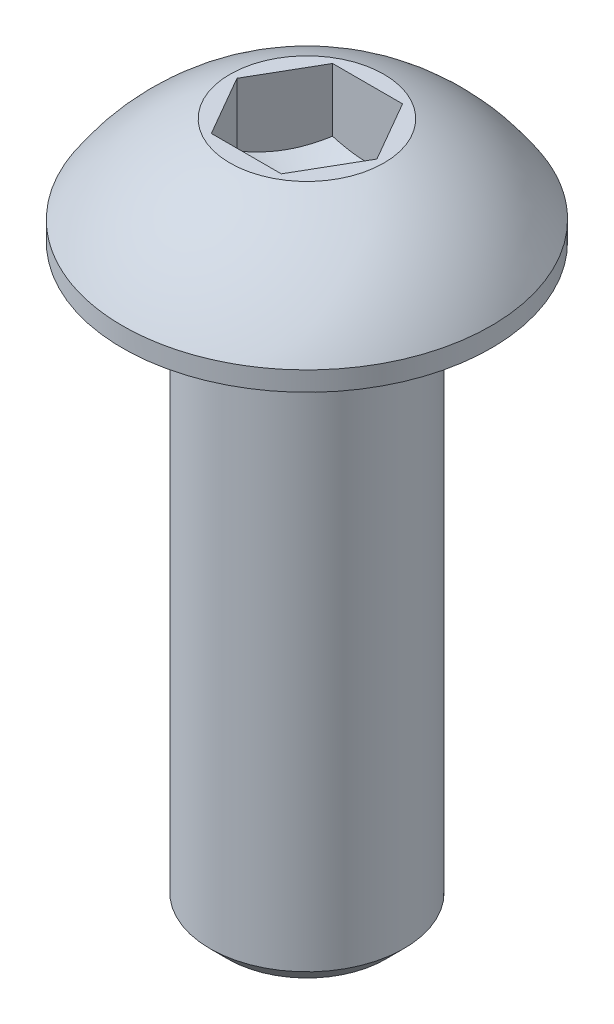
ISO-10303-21;
HEADER;
FILE_DESCRIPTION(('STEP AP214'),'2;1');
FILE_NAME('part.step','',(''),(''),'','','');
FILE_SCHEMA(('AUTOMOTIVE_DESIGN { 1 0 10303 214 1 1 1 1 }'));
ENDSEC;
DATA;
#1=APPLICATION_CONTEXT('core data for automotive mechanical design processes');
#2=APPLICATION_PROTOCOL_DEFINITION('international standard','automotive_design',2000,#1);
#3=PRODUCT_CONTEXT('',#1,'mechanical');
#4=PRODUCT('Part','Part','',(#3));
#5=PRODUCT_RELATED_PRODUCT_CATEGORY('part','',(#4));
#6=PRODUCT_DEFINITION_FORMATION('','',#4);
#7=PRODUCT_DEFINITION_CONTEXT('part definition',#1,'design');
#8=PRODUCT_DEFINITION('design','',#6,#7);
#9=PRODUCT_DEFINITION_SHAPE('','',#8);
#10=(LENGTH_UNIT() NAMED_UNIT(*) SI_UNIT(.MILLI.,.METRE.));
#11=(NAMED_UNIT(*) PLANE_ANGLE_UNIT() SI_UNIT($,.RADIAN.));
#12=(NAMED_UNIT(*) SI_UNIT($,.STERADIAN.) SOLID_ANGLE_UNIT());
#13=UNCERTAINTY_MEASURE_WITH_UNIT(LENGTH_MEASURE(1.E-05),#10,'distance_accuracy_value','');
#14=(GEOMETRIC_REPRESENTATION_CONTEXT(3) GLOBAL_UNCERTAINTY_ASSIGNED_CONTEXT((#13)) GLOBAL_UNIT_ASSIGNED_CONTEXT((#10,
#11,#12)) REPRESENTATION_CONTEXT('',''));
#15=CARTESIAN_POINT('',(0.,0.,0.));
#16=DIRECTION('',(0.,0.,1.));
#17=DIRECTION('',(1.,0.,0.));
#18=AXIS2_PLACEMENT_3D('',#15,#16,#17);
#19=CARTESIAN_POINT('',(-30.0000000000002,102.555381555533,5.00000000000031));
#20=DIRECTION('',(0.,1.,0.));
#21=DIRECTION('',(0.,0.,1.));
#22=AXIS2_PLACEMENT_3D('',#19,#20,#21);
#23=CONICAL_SURFACE('',#22,1.45182112759781,1.04719755102484);
#24=CARTESIAN_POINT('',(-31.4425009344978,102.550000607324,5.00000173704625));
#25=CARTESIAN_POINT('',(-31.410819479413,102.531703843318,4.94509446058189));
#26=CARTESIAN_POINT('',(-31.3788645203618,102.515065492756,4.88971321817337));
#27=CARTESIAN_POINT('',(-31.3144015746558,102.486027407757,4.77799231909157));
#28=CARTESIAN_POINT('',(-31.2818924447597,102.473637942221,4.72165068115827));
#29=CARTESIAN_POINT('',(-31.2172774082382,102.454358012273,4.6096662217099));
#30=CARTESIAN_POINT('',(-31.185181431385,102.44733905443,4.55404060976605));
#31=CARTESIAN_POINT('',(-31.1208390033007,102.43897001528,4.44252860112849));
#32=CARTESIAN_POINT('',(-31.0885927850041,102.4376129893,4.38664260813041));
#33=CARTESIAN_POINT('',(-31.0283172388499,102.440485620125,4.28217892365365));
#34=CARTESIAN_POINT('',(-31.000278874552,102.444019311793,4.23358557119319));
#35=CARTESIAN_POINT('',(-30.9443853171187,102.455206810491,4.13671632078358));
#36=CARTESIAN_POINT('',(-30.9165303181566,102.46286443872,4.08844075935681));
#37=CARTESIAN_POINT('',(-30.8605220282846,102.482002010411,3.99137266601796));
#38=CARTESIAN_POINT('',(-30.8323758422625,102.493563031245,3.94259244760199));
#39=CARTESIAN_POINT('',(-30.7765037158745,102.51979767783,3.84576033946362));
#40=CARTESIAN_POINT('',(-30.7487770574664,102.534465133101,3.79770720530085));
#41=CARTESIAN_POINT('',(-30.721249415442,102.550379544239,3.74999898690109));
#42=B_SPLINE_CURVE_WITH_KNOTS('',3,(#24,#25,#26,#27,#28,#29,#30,#31,#32,#33,#34,#35,#36,#37,#38,
#39,#40,#41),.UNSPECIFIED.,.F.,.F.,(4,2,2,2,2,2,2,2,4),(0.,0.198016347624792,0.396507952137321,
0.590087601482667,0.783429744788845,0.951909558632739,1.12054575346618,1.29292547618727,
1.46496595032371),.UNSPECIFIED.);
#43=CARTESIAN_POINT('',(-31.4425009368987,102.550000540922,5.00000009283334));
#44=VERTEX_POINT('',#43);
#45=CARTESIAN_POINT('',(-30.7212507379526,102.550379667054,3.74999950439706));
#46=VERTEX_POINT('',#45);
#47=EDGE_CURVE('E184',#44,#46,#42,.T.);
#48=ORIENTED_EDGE('',*,*,#47,.F.);
#49=CARTESIAN_POINT('',(-30.7212493477697,102.5503795772,6.25000121040915));
#50=CARTESIAN_POINT('',(-30.7529414630262,102.53205197295,6.19507548277011));
#51=CARTESIAN_POINT('',(-30.7849071388119,102.515380783234,6.13967567700744));
#52=CARTESIAN_POINT('',(-30.8493925376701,102.486274400232,6.02791587153329));
#53=CARTESIAN_POINT('',(-30.8819134102336,102.473849511414,5.9715538797005));
#54=CARTESIAN_POINT('',(-30.9465523748851,102.454499087759,5.85952794846716));
#55=CARTESIAN_POINT('',(-30.9786604999822,102.447444995303,5.80388128305856));
#56=CARTESIAN_POINT('',(-31.0430286594106,102.439008210663,5.69232467986737));
#57=CARTESIAN_POINT('',(-31.0752884582773,102.43761855235,5.6364151501668));
#58=CARTESIAN_POINT('',(-31.1355645357797,102.440434374817,5.53195054469247));
#59=CARTESIAN_POINT('',(-31.1635897468472,102.443939101548,5.48337998816502));
#60=CARTESIAN_POINT('',(-31.2194580550743,102.455067201903,5.38655449724099));
#61=CARTESIAN_POINT('',(-31.2473009593221,102.462694390664,5.33829989718028));
#62=CARTESIAN_POINT('',(-31.3032853049853,102.48177080445,5.24127330159502));
#63=CARTESIAN_POINT('',(-31.3314196637436,102.493301075418,5.19251358103878));
#64=CARTESIAN_POINT('',(-31.387268810722,102.519475780463,5.09572129857133));
#65=CARTESIAN_POINT('',(-31.4149843142277,102.534114056184,5.04768749699719));
#66=CARTESIAN_POINT('',(-31.4425008839922,102.550000510376,4.99999846795169));
#67=B_SPLINE_CURVE_WITH_KNOTS('',3,(#49,#50,#51,#52,#53,#54,#55,#56,#57,#58,#59,#60,#61,#62,#63,
#64,#65,#66),.UNSPECIFIED.,.F.,.F.,(4,2,2,2,2,2,2,2,4),(0.,0.198103571832307,0.39668452226255,
0.590348169787471,0.783773577558266,0.952169294667911,1.12072112127578,1.29301265591581,
1.4649659373382),.UNSPECIFIED.);
#68=CARTESIAN_POINT('',(-30.7212506140921,102.550379679614,6.25000059218622));
#69=VERTEX_POINT('',#68);
#70=EDGE_CURVE('E190',#69,#44,#67,.T.);
#71=ORIENTED_EDGE('',*,*,#70,.F.);
#72=CARTESIAN_POINT('',(-30.0000000000002,102.43886007314,6.25000000000031));
#73=CARTESIAN_POINT('',(-30.0306143036005,102.438856176585,6.25000000000031));
#74=CARTESIAN_POINT('',(-30.0612244571772,102.439509811159,6.25000000000031));
#75=CARTESIAN_POINT('',(-30.1223847403642,102.44209786512,6.25000000000031));
#76=CARTESIAN_POINT('',(-30.1529348806337,102.444032031571,6.25000000000031));
#77=CARTESIAN_POINT('',(-30.2441210440493,102.451677932129,6.25000000000031));
#78=CARTESIAN_POINT('',(-30.3046096866325,102.459233798249,6.25000000000031));
#79=CARTESIAN_POINT('',(-30.4247902706306,102.478664722068,6.25000000000031));
#80=CARTESIAN_POINT('',(-30.4844830224988,102.490534971946,6.25000000000031));
#81=CARTESIAN_POINT('',(-30.6033554278899,102.517911616148,6.25000000000031));
#82=CARTESIAN_POINT('',(-30.6625309411676,102.533436154556,6.25000000000031));
#83=CARTESIAN_POINT('',(-30.7212518888143,102.550379751289,6.25000000000031));
#84=B_SPLINE_CURVE_WITH_KNOTS('',3,(#72,#73,#74,#75,#76,#77,#78,#79,#80,#81,#82,#83),
.UNSPECIFIED.,.F.,.F.,(4,2,2,2,2,4),(0.,0.0918281955853517,0.183638258208279,0.366310716538347,
0.548780231075905,0.732175590344024),.UNSPECIFIED.);
#85=CARTESIAN_POINT('',(-30.0000000000002,102.438859948153,6.2499997834998));
#86=VERTEX_POINT('',#85);
#87=EDGE_CURVE('E196',#86,#69,#84,.T.);
#88=ORIENTED_EDGE('',*,*,#87,.F.);
#89=CARTESIAN_POINT('',(-30.0000000000002,102.438860073164,6.25000000003245));
#90=CARTESIAN_POINT('',(-29.9999999999397,102.408789746638,6.19791666668859));
#91=CARTESIAN_POINT('',(-29.9999999998867,102.378719420111,6.1458333333446));
#92=CARTESIAN_POINT('',(-29.999999999796,102.318578767059,6.04166666665663));
#93=CARTESIAN_POINT('',(-29.9999999997582,102.288508440533,5.98958333331265));
#94=CARTESIAN_POINT('',(-29.9999999996976,102.22836778748,5.88541666662492));
#95=CARTESIAN_POINT('',(-29.999999999675,102.198297460953,5.83333333328119));
#96=CARTESIAN_POINT('',(-29.9999999996447,102.138156807902,5.72916666659272));
#97=CARTESIAN_POINT('',(-29.9999999996371,102.108086481377,5.677083333248));
#98=CARTESIAN_POINT('',(-29.9999999996371,102.047945828342,5.57291666659887));
#99=CARTESIAN_POINT('',(-29.9999999996447,102.017875501832,5.52083333329446));
#100=CARTESIAN_POINT('',(-29.999999999675,101.95773484878,5.41666666660624));
#101=CARTESIAN_POINT('',(-29.9999999996976,101.927664522238,5.36458333322244));
#102=CARTESIAN_POINT('',(-29.9999999997582,101.867523869187,5.26041666653373));
#103=CARTESIAN_POINT('',(-29.999999999796,101.837453542677,5.20833333322884));
#104=CARTESIAN_POINT('',(-29.9999999998867,101.77731288964,5.10416666658116));
#105=CARTESIAN_POINT('',(-29.9999999999397,101.747242563111,5.05208333323837));
#106=CARTESIAN_POINT('',(-30.0000000000002,101.71717223659,4.99999999989148));
#107=B_SPLINE_CURVE_WITH_KNOTS('',3,(#89,#90,#91,#92,#93,#94,#95,#96,#97,#98,#99,#100,#101,#102,
#103,#104,#105,#106),.UNSPECIFIED.,.F.,.F.,(4,2,2,2,2,2,2,2,4),(0.,0.180421959158307,
0.360843918316614,0.541265877474921,0.721687836633228,0.902109795664658,1.08253175494984,
1.26295371398127,1.44337567313958),.UNSPECIFIED.);
#108=CARTESIAN_POINT('',(-30.0000000000002,101.717172236619,4.99999999994347));
#109=VERTEX_POINT('',#108);
#110=EDGE_CURVE('E135',#86,#109,#107,.T.);
#111=ORIENTED_EDGE('',*,*,#110,.T.);
#112=DIRECTION('',(0.,-0.499999999999998,0.86602540378444));
#113=VECTOR('',#112,1.);
#114=CARTESIAN_POINT('',(-30.0000000000002,288202.388249205,-499000.));
#115=LINE('',#114,#113);
#116=CARTESIAN_POINT('',(-30.0000000000002,102.438860073103,3.75000000004108));
#117=VERTEX_POINT('',#116);
#118=EDGE_CURVE('E122',#109,#117,#115,.F.);
#119=ORIENTED_EDGE('',*,*,#118,.T.);
#120=CARTESIAN_POINT('',(-30.7212520262086,102.550379872105,3.75000012399811));
#121=CARTESIAN_POINT('',(-30.6625310778555,102.533436220286,3.75000004436325));
#122=CARTESIAN_POINT('',(-30.6033555562019,102.517911655819,3.75000001184473));
#123=CARTESIAN_POINT('',(-30.48448312796,102.490534986166,3.74999998821569));
#124=CARTESIAN_POINT('',(-30.4247903616632,102.478664736714,3.74999999689695));
#125=CARTESIAN_POINT('',(-30.3046097513678,102.459233808794,3.75000000310712));
#126=CARTESIAN_POINT('',(-30.2441210969323,102.451677938053,3.75000000062361));
#127=CARTESIAN_POINT('',(-30.1529349146619,102.444032033674,3.74999999968704));
#128=CARTESIAN_POINT('',(-30.1223847677006,102.44209786647,3.74999999984366));
#129=CARTESIAN_POINT('',(-30.0612244709165,102.439509811546,3.75000000015699));
#130=CARTESIAN_POINT('',(-30.0306143104343,102.438856176772,3.7500000003137));
#131=CARTESIAN_POINT('',(-30.0000000000001,102.43886007314,3.75000000000031));
#132=B_SPLINE_CURVE_WITH_KNOTS('',3,(#120,#121,#122,#123,#124,#125,#126,#127,#128,#129,#130,
#131),.UNSPECIFIED.,.F.,.F.,(4,2,2,2,2,4),(0.,0.18339540321598,0.365864958952668,
0.548537454782071,0.640347537511257,0.732175753737438),.UNSPECIFIED.);
#133=EDGE_CURVE('E179',#46,#117,#132,.T.);
#134=ORIENTED_EDGE('',*,*,#133,.F.);
#135=EDGE_LOOP('',(#48,#71,#88,#111,#119,#134));
#136=FACE_BOUND('',#135,.T.);
#137=ADVANCED_FACE('F17',(#136),#23,.F.);
#138=CARTESIAN_POINT('',(-30.0000000000002,102.555381555419,5.00000000000031));
#139=DIRECTION('',(0.,1.,0.));
#140=DIRECTION('',(0.,0.,1.));
#141=AXIS2_PLACEMENT_3D('',#138,#139,#140);
#142=CONICAL_SURFACE('',#141,1.45182112749384,1.04719755107241);
#143=CARTESIAN_POINT('',(-28.5574990655019,102.55000060728,4.99999826293781));
#144=CARTESIAN_POINT('',(-28.5891805205821,102.531703843273,5.05490553940403));
#145=CARTESIAN_POINT('',(-28.6211354796314,102.515065492711,5.11028678181326));
#146=CARTESIAN_POINT('',(-28.6855984253358,102.486027407713,5.2220076808953));
#147=CARTESIAN_POINT('',(-28.7181075552323,102.473637942179,5.27834931882814));
#148=CARTESIAN_POINT('',(-28.7827225917539,102.454358012232,5.39033377827591));
#149=CARTESIAN_POINT('',(-28.8148185686069,102.44733905439,5.44595939021964));
#150=CARTESIAN_POINT('',(-28.8791609966908,102.43897001524,5.55747139885689));
#151=CARTESIAN_POINT('',(-28.9114072149874,102.437612989259,5.61335739185479));
#152=CARTESIAN_POINT('',(-28.9716827611427,102.440485620083,5.71782107633344));
#153=CARTESIAN_POINT('',(-28.9997211254418,102.44401931175,5.76641442879598));
#154=CARTESIAN_POINT('',(-29.0556146828775,102.455206810447,5.86328367920978));
#155=CARTESIAN_POINT('',(-29.0834696818409,102.462864438675,5.91155924063868));
#156=CARTESIAN_POINT('',(-29.1394779717153,102.482002010365,6.00862733398175));
#157=CARTESIAN_POINT('',(-29.1676241577386,102.493563031199,6.05740755239983));
#158=CARTESIAN_POINT('',(-29.2234962841291,102.519797677782,6.15423966054253));
#159=CARTESIAN_POINT('',(-29.2512229425384,102.534465133052,6.20229279470752));
#160=CARTESIAN_POINT('',(-29.2787505845642,102.550379544189,6.25000101310953));
#161=B_SPLINE_CURVE_WITH_KNOTS('',3,(#143,#144,#145,#146,#147,#148,#149,#150,#151,#152,#153,
#154,#155,#156,#157,#158,#159,#160),.UNSPECIFIED.,.F.,.F.,(4,2,2,2,2,2,2,2,4),(0.,
0.198016347623609,0.3965079521347,0.590087601479405,0.783429744785066,0.951909558636019,
1.12054575347647,1.29292547620428,1.46496595034753),.UNSPECIFIED.);
#162=CARTESIAN_POINT('',(-28.5574990630946,102.550000540873,4.99999990716563));
#163=VERTEX_POINT('',#162);
#164=CARTESIAN_POINT('',(-29.278749262043,102.550379667005,6.25000049560901));
#165=VERTEX_POINT('',#164);
#166=EDGE_CURVE('E219',#163,#165,#161,.T.);
#167=ORIENTED_EDGE('',*,*,#166,.F.);
#168=CARTESIAN_POINT('',(-29.2787504943448,102.550379471608,3.74999887806983));
#169=CARTESIAN_POINT('',(-29.2470584297994,102.532051909024,3.80492463647616));
#170=CARTESIAN_POINT('',(-29.2150927772432,102.515380739639,3.86032445065578));
#171=CARTESIAN_POINT('',(-29.1506074004943,102.486274377935,3.97208425350117));
#172=CARTESIAN_POINT('',(-29.1180865267484,102.473849490071,4.02844623424679));
#173=CARTESIAN_POINT('',(-29.0534475659152,102.454499072361,4.14047214952056));
#174=CARTESIAN_POINT('',(-29.0213394456449,102.447444984883,4.19611880994691));
#175=CARTESIAN_POINT('',(-28.9569712944508,102.439008207817,4.30767540132477));
#176=CARTESIAN_POINT('',(-28.9247114989942,102.437618552086,4.36358492419518));
#177=CARTESIAN_POINT('',(-28.8644354281433,102.440434378398,4.46804951756581));
#178=CARTESIAN_POINT('',(-28.8364102202487,102.443939106563,4.51662006879011));
#179=CARTESIAN_POINT('',(-28.7805419182114,102.455067208681,4.61344554913111));
#180=CARTESIAN_POINT('',(-28.7526990169809,102.46269439778,4.66170014391106));
#181=CARTESIAN_POINT('',(-28.6967146777987,102.481770811208,4.75872672822188));
#182=CARTESIAN_POINT('',(-28.6685803224987,102.493301081405,4.8074864427951));
#183=CARTESIAN_POINT('',(-28.612731182433,102.519475784036,4.9042787133035));
#184=CARTESIAN_POINT('',(-28.5850156823806,102.534114058104,4.95231250890331));
#185=CARTESIAN_POINT('',(-28.5574991160025,102.550000510327,5.0000015320586));
#186=B_SPLINE_CURVE_WITH_KNOTS('',3,(#168,#169,#170,#171,#172,#173,#174,#175,#176,#177,#178,
#179,#180,#181,#182,#183,#184,#185),.UNSPECIFIED.,.F.,.F.,(4,2,2,2,2,2,2,2,4),(0.,
0.198103544048142,0.396684468195019,0.5903480936196,0.783773478657684,0.952169177537967,
1.12072098628025,1.29301250018237,1.46496576036911),.UNSPECIFIED.);
#187=CARTESIAN_POINT('',(-29.2787488271108,102.550379803612,3.74999948217506));
#188=VERTEX_POINT('',#187);
#189=EDGE_CURVE('E21',#188,#163,#186,.T.);
#190=ORIENTED_EDGE('',*,*,#189,.F.);
#191=CARTESIAN_POINT('',(-30.0000000000001,102.438860073099,3.75000000000031));
#192=CARTESIAN_POINT('',(-29.9693856877621,102.438856176539,3.75000000000031));
#193=CARTESIAN_POINT('',(-29.9387755255513,102.439509811484,3.75000000000031));
#194=CARTESIAN_POINT('',(-29.8776152251495,102.442097866901,3.75000000000031));
#195=CARTESIAN_POINT('',(-29.8470650762994,102.444032034435,3.75000000000031));
#196=CARTESIAN_POINT('',(-29.7558788874749,102.451677939229,3.75000000000031));
#197=CARTESIAN_POINT('',(-29.6953902281852,102.459233809489,3.75000000000031));
#198=CARTESIAN_POINT('',(-29.5752096113873,102.478664743593,3.75000000000031));
#199=CARTESIAN_POINT('',(-29.5155168434246,102.490534999607,3.75000000000031));
#200=CARTESIAN_POINT('',(-29.3966444061429,102.517911657509,3.75000000000031));
#201=CARTESIAN_POINT('',(-29.3374688770733,102.533436203494,3.75000000000031));
#202=CARTESIAN_POINT('',(-29.2787479138688,102.550379808171,3.75000000000031));
#203=B_SPLINE_CURVE_WITH_KNOTS('',3,(#191,#192,#193,#194,#195,#196,#197,#198,#199,#200,#201,
#202),.UNSPECIFIED.,.F.,.F.,(4,2,2,2,2,4),(0.,0.091828221486108,0.18363830998466,
0.36631081943489,0.548780384858538,0.732175795635302),.UNSPECIFIED.);
#204=EDGE_CURVE('E103',#117,#188,#203,.T.);
#205=ORIENTED_EDGE('',*,*,#204,.F.);
#206=ORIENTED_EDGE('',*,*,#118,.F.);
#207=ORIENTED_EDGE('',*,*,#110,.F.);
#208=CARTESIAN_POINT('',(-29.2787479737771,102.550379872061,6.24999987599491));
#209=CARTESIAN_POINT('',(-29.337468922131,102.533436220241,6.24999995563465));
#210=CARTESIAN_POINT('',(-29.3966444437858,102.517911655773,6.24999998815517));
#211=CARTESIAN_POINT('',(-29.5155168720304,102.490534986121,6.25000001178566));
#212=CARTESIAN_POINT('',(-29.5752096383287,102.47866473667,6.25000000310386));
#213=CARTESIAN_POINT('',(-29.6953902486267,102.459233808752,6.24999999689331));
#214=CARTESIAN_POINT('',(-29.7558789030634,102.451677938011,6.24999999937697));
#215=CARTESIAN_POINT('',(-29.8470650853355,102.444032033633,6.2500000003136));
#216=CARTESIAN_POINT('',(-29.8776152322974,102.442097866429,6.25000000015697));
#217=CARTESIAN_POINT('',(-29.9387755290826,102.439509811505,6.24999999984362));
#218=CARTESIAN_POINT('',(-29.9693856895654,102.438856176731,6.2499999996869));
#219=CARTESIAN_POINT('',(-30.0000000000002,102.438860073099,6.25000000000031));
#220=B_SPLINE_CURVE_WITH_KNOTS('',3,(#208,#209,#210,#211,#212,#213,#214,#215,#216,#217,#218,
#219),.UNSPECIFIED.,.F.,.F.,(4,2,2,2,2,4),(0.,0.183395403219622,0.365864958959963,
0.548537454792752,0.640347537523615,0.732175753751514),.UNSPECIFIED.);
#221=EDGE_CURVE('E213',#165,#86,#220,.T.);
#222=ORIENTED_EDGE('',*,*,#221,.F.);
#223=EDGE_LOOP('',(#167,#190,#205,#206,#207,#222));
#224=FACE_BOUND('',#223,.T.);
#225=ADVANCED_FACE('F128',(#224),#142,.F.);
#226=CARTESIAN_POINT('',(-28.5457747860706,101.610428354967,5.02032099467887));
#227=DIRECTION('',(-0.866156744758905,0.,0.499772441725889));
#228=DIRECTION('',(0.499772441725889,0.,0.866156744758905));
#229=AXIS2_PLACEMENT_3D('',#226,#227,#228);
#230=PLANE('',#229);
#231=ORIENTED_EDGE('',*,*,#189,.T.);
#232=DIRECTION('',(0.,1.,0.));
#233=VECTOR('',#232,1.);
#234=CARTESIAN_POINT('',(-28.5575000000002,101.610428354967,5.00000000000028));
#235=LINE('',#234,#233);
#236=CARTESIAN_POINT('',(-28.5574998872849,103.85,5.00000058675331));
#237=VERTEX_POINT('',#236);
#238=EDGE_CURVE('E91',#237,#163,#235,.F.);
#239=ORIENTED_EDGE('',*,*,#238,.F.);
#240=DIRECTION('',(0.499772441725941,0.,0.866156744758875));
#241=VECTOR('',#240,1.);
#242=CARTESIAN_POINT('',(-29.2787500000002,103.85,3.75000000000031));
#243=LINE('',#242,#241);
#244=CARTESIAN_POINT('',(-29.2787470566511,103.85,3.75000000000031));
#245=VERTEX_POINT('',#244);
#246=EDGE_CURVE('E85',#245,#237,#243,.T.);
#247=ORIENTED_EDGE('',*,*,#246,.F.);
#248=DIRECTION('',(0.,1.,0.));
#249=VECTOR('',#248,1.);
#250=CARTESIAN_POINT('',(-29.2787470566511,101.610428354967,3.75000000000031));
#251=LINE('',#250,#249);
#252=EDGE_CURVE('E88',#188,#245,#251,.T.);
#253=ORIENTED_EDGE('',*,*,#252,.F.);
#254=EDGE_LOOP('',(#231,#239,#247,#253));
#255=FACE_BOUND('',#254,.T.);
#256=ADVANCED_FACE('F87',(#255),#230,.T.);
#257=CARTESIAN_POINT('',(-29.2904752139297,101.610428354967,6.27032099467887));
#258=DIRECTION('',(-0.866156744758906,0.,-0.499772441725888));
#259=DIRECTION('',(-0.499772441725888,0.,0.866156744758906));
#260=AXIS2_PLACEMENT_3D('',#257,#258,#259);
#261=PLANE('',#260);
#262=ORIENTED_EDGE('',*,*,#166,.T.);
#263=DIRECTION('',(0.,1.,0.));
#264=VECTOR('',#263,1.);
#265=CARTESIAN_POINT('',(-29.2787500000003,101.610428354967,6.25000000000031));
#266=LINE('',#265,#264);
#267=CARTESIAN_POINT('',(-29.2787502258029,103.85,6.25000000000031));
#268=VERTEX_POINT('',#267);
#269=EDGE_CURVE('E218',#268,#165,#266,.F.);
#270=ORIENTED_EDGE('',*,*,#269,.F.);
#271=DIRECTION('',(-0.499772441725993,0.,0.866156744758845));
#272=VECTOR('',#271,1.);
#273=CARTESIAN_POINT('',(-28.5575000000001,103.85,5.00000000000031));
#274=LINE('',#273,#272);
#275=EDGE_CURVE('E96',#237,#268,#274,.T.);
#276=ORIENTED_EDGE('',*,*,#275,.F.);
#277=ORIENTED_EDGE('',*,*,#238,.T.);
#278=EDGE_LOOP('',(#262,#270,#276,#277));
#279=FACE_BOUND('',#278,.T.);
#280=ADVANCED_FACE('F209',(#279),#261,.T.);
#281=CARTESIAN_POINT('',(-30.7447111053966,101.610428354967,6.25000000000031));
#282=DIRECTION('',(0.,0.,-1.));
#283=DIRECTION('',(-1.,0.,0.));
#284=AXIS2_PLACEMENT_3D('',#281,#282,#283);
#285=PLANE('',#284);
#286=ORIENTED_EDGE('',*,*,#87,.T.);
#287=DIRECTION('',(0.,1.,0.));
#288=VECTOR('',#287,1.);
#289=CARTESIAN_POINT('',(-30.7212500000002,101.610428354967,6.25000000000026));
#290=LINE('',#289,#288);
#291=CARTESIAN_POINT('',(-30.7212501837922,103.85,6.24999968147011));
#292=VERTEX_POINT('',#291);
#293=EDGE_CURVE('E195',#292,#69,#290,.F.);
#294=ORIENTED_EDGE('',*,*,#293,.F.);
#295=DIRECTION('',(1.,0.,0.));
#296=VECTOR('',#295,1.);
#297=CARTESIAN_POINT('',(-31.6184850000003,103.85,6.25000000000031));
#298=LINE('',#297,#296);
#299=EDGE_CURVE('E143',#268,#292,#298,.F.);
#300=ORIENTED_EDGE('',*,*,#299,.F.);
#301=ORIENTED_EDGE('',*,*,#269,.T.);
#302=ORIENTED_EDGE('',*,*,#221,.T.);
#303=EDGE_LOOP('',(#286,#294,#300,#301,#302));
#304=FACE_BOUND('',#303,.T.);
#305=ADVANCED_FACE('F205',(#304),#285,.T.);
#306=CARTESIAN_POINT('',(-31.4542252139297,101.610428354967,4.97967900532175));
#307=DIRECTION('',(0.866156744758905,0.,-0.499772441725889));
#308=DIRECTION('',(-0.499772441725889,0.,-0.866156744758905));
#309=AXIS2_PLACEMENT_3D('',#306,#307,#308);
#310=PLANE('',#309);
#311=ORIENTED_EDGE('',*,*,#70,.T.);
#312=DIRECTION('',(0.,1.,0.));
#313=VECTOR('',#312,1.);
#314=CARTESIAN_POINT('',(-31.4425000000002,101.610428354967,5.0000000000003));
#315=LINE('',#314,#313);
#316=CARTESIAN_POINT('',(-31.4424998306193,103.85,4.99999970644586));
#317=VERTEX_POINT('',#316);
#318=EDGE_CURVE('E189',#317,#44,#315,.F.);
#319=ORIENTED_EDGE('',*,*,#318,.F.);
#320=DIRECTION('',(-0.499772441725836,0.,-0.866156744758936));
#321=VECTOR('',#320,1.);
#322=CARTESIAN_POINT('',(-30.7212500000003,103.85,6.25000000000031));
#323=LINE('',#322,#321);
#324=EDGE_CURVE('E113',#292,#317,#323,.T.);
#325=ORIENTED_EDGE('',*,*,#324,.F.);
#326=ORIENTED_EDGE('',*,*,#293,.T.);
#327=EDGE_LOOP('',(#311,#319,#325,#326));
#328=FACE_BOUND('',#327,.T.);
#329=ADVANCED_FACE('F202',(#328),#310,.T.);
#330=CARTESIAN_POINT('',(-30.7095247860707,101.610428354967,3.72967900532175));
#331=DIRECTION('',(0.866156744758906,0.,0.499772441725888));
#332=DIRECTION('',(0.499772441725888,0.,-0.866156744758906));
#333=AXIS2_PLACEMENT_3D('',#330,#331,#332);
#334=PLANE('',#333);
#335=ORIENTED_EDGE('',*,*,#47,.T.);
#336=DIRECTION('',(0.,1.,0.));
#337=VECTOR('',#336,1.);
#338=CARTESIAN_POINT('',(-30.7212500000002,101.610428354967,3.75000000000031));
#339=LINE('',#338,#337);
#340=CARTESIAN_POINT('',(-30.7212497741976,103.85,3.75000000000031));
#341=VERTEX_POINT('',#340);
#342=EDGE_CURVE('E40',#341,#46,#339,.F.);
#343=ORIENTED_EDGE('',*,*,#342,.F.);
#344=DIRECTION('',(0.499772441725888,0.,-0.866156744758905));
#345=VECTOR('',#344,1.);
#346=CARTESIAN_POINT('',(-31.4425000000002,103.85,5.00000000000031));
#347=LINE('',#346,#345);
#348=EDGE_CURVE('E107',#317,#341,#347,.T.);
#349=ORIENTED_EDGE('',*,*,#348,.F.);
#350=ORIENTED_EDGE('',*,*,#318,.T.);
#351=EDGE_LOOP('',(#335,#343,#349,#350));
#352=FACE_BOUND('',#351,.T.);
#353=ADVANCED_FACE('F175',(#352),#334,.T.);
#354=CARTESIAN_POINT('',(-29.2552888946038,101.610428354967,3.75000000000031));
#355=DIRECTION('',(0.,0.,1.));
#356=DIRECTION('',(1.,0.,0.));
#357=AXIS2_PLACEMENT_3D('',#354,#355,#356);
#358=PLANE('',#357);
#359=ORIENTED_EDGE('',*,*,#204,.T.);
#360=ORIENTED_EDGE('',*,*,#252,.T.);
#361=DIRECTION('',(1.,0.,0.));
#362=VECTOR('',#361,1.);
#363=CARTESIAN_POINT('',(-31.6184850000003,103.85,3.75000000000031));
#364=LINE('',#363,#362);
#365=EDGE_CURVE('E100',#341,#245,#364,.T.);
#366=ORIENTED_EDGE('',*,*,#365,.F.);
#367=ORIENTED_EDGE('',*,*,#342,.T.);
#368=ORIENTED_EDGE('',*,*,#133,.T.);
#369=EDGE_LOOP('',(#359,#360,#366,#367,#368));
#370=FACE_BOUND('',#369,.T.);
#371=ADVANCED_FACE('F99',(#370),#358,.T.);
#372=CARTESIAN_POINT('',(-31.6184850000003,103.85,6.61848500000031));
#373=DIRECTION('',(0.,1.,0.));
#374=DIRECTION('',(0.,0.,1.));
#375=AXIS2_PLACEMENT_3D('',#372,#373,#374);
#376=PLANE('',#375);
#377=CARTESIAN_POINT('',(-30.0000000000002,103.85,3.41324999999905));
#378=CARTESIAN_POINT('',(-29.9109378537396,103.85,3.41325504270341));
#379=CARTESIAN_POINT('',(-29.82171720208,103.85,3.42078967678643));
#380=CARTESIAN_POINT('',(-29.6898616124458,103.85,3.44320989971469));
#381=CARTESIAN_POINT('',(-29.6461831003794,103.85,3.45255590348604));
#382=CARTESIAN_POINT('',(-29.559725505005,103.85,3.47490099594449));
#383=CARTESIAN_POINT('',(-29.516947181995,103.85,3.48790304913285));
#384=CARTESIAN_POINT('',(-29.3906372924842,103.849999999999,3.53221441934427));
#385=CARTESIAN_POINT('',(-29.308918205035,103.85,3.56886534150499));
#386=CARTESIAN_POINT('',(-29.1527995679228,103.85,3.65538430229451));
#387=CARTESIAN_POINT('',(-29.078400296654,103.849999999999,3.70525284336202));
#388=CARTESIAN_POINT('',(-28.9739072496696,103.85,3.78884044182003));
#389=CARTESIAN_POINT('',(-28.9402408588876,103.85,3.81818917665612));
#390=CARTESIAN_POINT('',(-28.875529210165,103.85,3.8795854087374));
#391=CARTESIAN_POINT('',(-28.8444814563534,103.85,3.91163027668697));
#392=CARTESIAN_POINT('',(-28.7555379346317,103.85,4.0115529035981));
#393=CARTESIAN_POINT('',(-28.7018193042047,103.85,4.08323680219793));
#394=CARTESIAN_POINT('',(-28.6072110661824,103.85,4.23456680566875));
#395=CARTESIAN_POINT('',(-28.5663209748423,103.85,4.31421261015894));
#396=CARTESIAN_POINT('',(-28.498485051424,103.85,4.47924746647695));
#397=CARTESIAN_POINT('',(-28.4715390704163,103.85,4.56463645695387));
#398=CARTESIAN_POINT('',(-28.4323672519397,103.85,4.7387243327779));
#399=CARTESIAN_POINT('',(-28.4201414930831,103.85,4.82742323579875));
#400=CARTESIAN_POINT('',(-28.4107536009073,103.85,5.00561465855965));
#401=CARTESIAN_POINT('',(-28.413591467588,103.85,5.09510717829971));
#402=CARTESIAN_POINT('',(-28.4342538089119,103.85,5.27234737555389));
#403=CARTESIAN_POINT('',(-28.4520782035208,103.85,5.36009506238357));
#404=CARTESIAN_POINT('',(-28.5021972317674,103.85,5.53134429395423));
#405=CARTESIAN_POINT('',(-28.5344920199567,103.85,5.61484579333299));
#406=CARTESIAN_POINT('',(-28.6126752180926,103.85,5.77527919441072));
#407=CARTESIAN_POINT('',(-28.658564140669,103.85,5.8522108482222));
#408=CARTESIAN_POINT('',(-28.736515712944,103.85,5.96092622802154));
#409=CARTESIAN_POINT('',(-28.7640244118052,103.85,5.99605610228281));
#410=CARTESIAN_POINT('',(-28.8219264931184,103.85,6.06391215414068));
#411=CARTESIAN_POINT('',(-28.852322633903,103.85,6.09663597925573));
#412=CARTESIAN_POINT('',(-28.9474540859187,103.85,6.1907406567244));
#413=CARTESIAN_POINT('',(-29.0162014547779,103.85,6.24815077977315));
#414=CARTESIAN_POINT('',(-29.162364683778,103.85,6.3505952521376));
#415=CARTESIAN_POINT('',(-29.2397802142711,103.85,6.39563007185775));
#416=CARTESIAN_POINT('',(-29.3607347596438,103.85,6.45296839823682));
#417=CARTESIAN_POINT('',(-29.401910049534,103.85,6.47039348960298));
#418=CARTESIAN_POINT('',(-29.4855410691737,103.85,6.50169958340169));
#419=CARTESIAN_POINT('',(-29.5279957313333,103.85,6.51558345403449));
#420=CARTESIAN_POINT('',(-29.656765531659,103.85,6.55173454583042));
#421=CARTESIAN_POINT('',(-29.7447005495725,103.849999999999,6.56860250414898));
#422=CARTESIAN_POINT('',(-29.8609649500685,103.85,6.58089387795141));
#423=CARTESIAN_POINT('',(-29.888722726079,103.85,6.58308802827313));
#424=CARTESIAN_POINT('',(-29.9443151682785,103.85,6.58601687773728));
#425=CARTESIAN_POINT('',(-29.9721498344675,103.85,6.58675157687971));
#426=CARTESIAN_POINT('',(-30.0890621462608,103.85,6.58674495729712));
#427=CARTESIAN_POINT('',(-30.1782827979204,103.85,6.57921032321414));
#428=CARTESIAN_POINT('',(-30.3101383875546,103.85,6.55679010028588));
#429=CARTESIAN_POINT('',(-30.353816899621,103.85,6.54744409651453));
#430=CARTESIAN_POINT('',(-30.4402744949954,103.85,6.52509900405607));
#431=CARTESIAN_POINT('',(-30.4830528180054,103.85,6.5120969508677));
#432=CARTESIAN_POINT('',(-30.6093627075162,103.849999999999,6.46778558065626));
#433=CARTESIAN_POINT('',(-30.6910817949654,103.85,6.43113465849553));
#434=CARTESIAN_POINT('',(-30.8472004320775,103.85,6.34461569770599));
#435=CARTESIAN_POINT('',(-30.9215997033463,103.849999999999,6.29474715663848));
#436=CARTESIAN_POINT('',(-31.0260927503307,103.85,6.21115955818045));
#437=CARTESIAN_POINT('',(-31.0597591411127,103.85,6.18181082334437));
#438=CARTESIAN_POINT('',(-31.1244707898353,103.85,6.12041459126308));
#439=CARTESIAN_POINT('',(-31.1555185436469,103.85,6.0883697233135));
#440=CARTESIAN_POINT('',(-31.2444620653686,103.85,5.98844709640236));
#441=CARTESIAN_POINT('',(-31.2981806957956,103.85,5.91676319780252));
#442=CARTESIAN_POINT('',(-31.3927889338179,103.85,5.76543319433169));
#443=CARTESIAN_POINT('',(-31.433679025158,103.85,5.6857873898415));
#444=CARTESIAN_POINT('',(-31.5015149485763,103.85,5.52075253352347));
#445=CARTESIAN_POINT('',(-31.528460929584,103.85,5.43536354304655));
#446=CARTESIAN_POINT('',(-31.5676327480605,103.85,5.26127566722252));
#447=CARTESIAN_POINT('',(-31.5798585069171,103.85,5.17257676420167));
#448=CARTESIAN_POINT('',(-31.5892463990929,103.85,4.99438534144077));
#449=CARTESIAN_POINT('',(-31.5864085324121,103.85,4.90489282170071));
#450=CARTESIAN_POINT('',(-31.5657461910883,103.85,4.72765262444654));
#451=CARTESIAN_POINT('',(-31.5479217964793,103.85,4.63990493761686));
#452=CARTESIAN_POINT('',(-31.4978027682328,103.85,4.46865570604621));
#453=CARTESIAN_POINT('',(-31.4655079800434,103.85,4.38515420666744));
#454=CARTESIAN_POINT('',(-31.3873247819075,103.85,4.22472080558973));
#455=CARTESIAN_POINT('',(-31.341435859331,103.85,4.14778915177826));
#456=CARTESIAN_POINT('',(-31.2634842870561,103.85,4.03907377197893));
#457=CARTESIAN_POINT('',(-31.2359755881949,103.85,4.00394389771766));
#458=CARTESIAN_POINT('',(-31.1780735068816,103.85,3.9360878458598));
#459=CARTESIAN_POINT('',(-31.147677366097,103.85,3.90336402074475));
#460=CARTESIAN_POINT('',(-31.0525459140814,103.85,3.80925934327609));
#461=CARTESIAN_POINT('',(-30.9837985452222,103.85,3.75184922022736));
#462=CARTESIAN_POINT('',(-30.8376353162221,103.85,3.64940474786292));
#463=CARTESIAN_POINT('',(-30.7602197857289,103.85,3.60436992814278));
#464=CARTESIAN_POINT('',(-30.6392652403562,103.85,3.54703160176372));
#465=CARTESIAN_POINT('',(-30.598089950466,103.85,3.52960651039756));
#466=CARTESIAN_POINT('',(-30.5144589308263,103.85,3.49830041659885));
#467=CARTESIAN_POINT('',(-30.4720042686667,103.85,3.48441654596605));
#468=CARTESIAN_POINT('',(-30.343234468341,103.85,3.44826545417012));
#469=CARTESIAN_POINT('',(-30.2552994504275,103.849999999999,3.43139749585155));
#470=CARTESIAN_POINT('',(-30.1390350499316,103.85,3.41910612204922));
#471=CARTESIAN_POINT('',(-30.1112772739212,103.85,3.41691197172752));
#472=CARTESIAN_POINT('',(-30.0556848317218,103.85,3.41398312226337));
#473=CARTESIAN_POINT('',(-30.0278501655328,103.85,3.41324842312092));
#474=CARTESIAN_POINT('',(-30.0000000000002,103.85,3.41324999999905));
#475=B_SPLINE_CURVE_WITH_KNOTS('',3,(#377,#378,#379,#380,#381,#382,#383,#384,#385,#386,#387,
#388,#389,#390,#391,#392,#393,#394,#395,#396,#397,#398,#399,#400,#401,#402,#403,#404,#405,#406,
#407,#408,#409,#410,#411,#412,#413,#414,#415,#416,#417,#418,#419,#420,#421,#422,#423,#424,#425,
#426,#427,#428,#429,#430,#431,#432,#433,#434,#435,#436,#437,#438,#439,#440,#441,#442,#443,#444,
#445,#446,#447,#448,#449,#450,#451,#452,#453,#454,#455,#456,#457,#458,#459,#460,#461,#462,#463,
#464,#465,#466,#467,#468,#469,#470,#471,#472,#473,#474),.UNSPECIFIED.,.T.,.F.,(4,2,2,2,2,2,2,2,
2,2,2,2,2,2,2,2,2,2,2,2,2,2,2,2,2,2,2,2,2,2,2,2,2,2,2,2,2,2,2,2,2,2,2,2,2,2,2,2,4),(0.,
0.267056844438431,0.400936254326221,0.534924534694895,0.802262389129768,1.06961040728276,
1.20345957924934,1.3371797004544,1.60453414720309,1.87187851120809,2.13922001979153,
2.40656295608577,2.67390589238003,2.94124740096347,3.20859176496847,3.47594621171688,
3.60966633292173,3.74351550488815,4.01086352304117,4.27820137747596,4.41218965784475,
4.54606906773273,4.81312591217068,4.89663588398827,4.98014585580591,5.24720270024433,
5.38108211013212,5.5150703905008,5.78240824493567,6.04975626308865,6.18360543505523,
6.31732555626029,6.58468000300898,6.85202436701398,7.11936587559743,7.38670881189167,
7.65405174818592,7.92139325676936,8.18873762077436,8.45609206752276,8.58981218872762,
8.72366136069403,8.99100937884705,9.25834723328184,9.39233551365063,9.52621492353862,
9.79327176797657,9.87678173979396,9.9602917116114),.UNSPECIFIED.);
#476=CARTESIAN_POINT('',(-30.0000000000002,103.85,3.41324999999905));
#477=VERTEX_POINT('',#476);
#478=EDGE_CURVE('E108',#477,#477,#475,.T.);
#479=ORIENTED_EDGE('',*,*,#478,.F.);
#480=EDGE_LOOP('',(#479));
#481=FACE_BOUND('',#480,.T.);
#482=ORIENTED_EDGE('',*,*,#348,.T.);
#483=ORIENTED_EDGE('',*,*,#365,.T.);
#484=ORIENTED_EDGE('',*,*,#246,.T.);
#485=ORIENTED_EDGE('',*,*,#275,.T.);
#486=ORIENTED_EDGE('',*,*,#299,.T.);
#487=ORIENTED_EDGE('',*,*,#324,.T.);
#488=EDGE_LOOP('',(#482,#483,#484,#485,#486,#487));
#489=FACE_BOUND('',#488,.T.);
#490=ADVANCED_FACE('F105',(#481,#489),#376,.T.);
#491=CARTESIAN_POINT('',(-30.0000000000001,99.6382709895838,5.00000000000031));
#492=DIRECTION('',(0.,0.,-1.));
#493=DIRECTION('',(1.,0.,0.));
#494=AXIS2_PLACEMENT_3D('',#491,#492,#493);
#495=SPHERICAL_SURFACE('',#494,4.50071514536138);
#496=ORIENTED_EDGE('',*,*,#478,.T.);
#497=EDGE_LOOP('',(#496));
#498=FACE_BOUND('',#497,.T.);
#499=CARTESIAN_POINT('',(-30.0000000000001,102.05,5.00000000000031));
#500=DIRECTION('',(0.,-1.,0.));
#501=DIRECTION('',(0.,0.,-1.));
#502=AXIS2_PLACEMENT_3D('',#499,#500,#501);
#503=CIRCLE('',#502,3.8);
#504=CARTESIAN_POINT('',(-30.0000000000001,102.05,1.20000000000031));
#505=VERTEX_POINT('',#504);
#506=EDGE_CURVE('E111',#505,#505,#503,.T.);
#507=ORIENTED_EDGE('',*,*,#506,.F.);
#508=EDGE_LOOP('',(#507));
#509=FACE_BOUND('',#508,.T.);
#510=ADVANCED_FACE('F165',(#498,#509),#495,.T.);
#511=CARTESIAN_POINT('',(-30.0000000000001,102.05,5.00000000000031));
#512=DIRECTION('',(0.,-1.,0.));
#513=DIRECTION('',(0.,0.,-1.));
#514=AXIS2_PLACEMENT_3D('',#511,#512,#513);
#515=CYLINDRICAL_SURFACE('',#514,3.8);
#516=ORIENTED_EDGE('',*,*,#506,.T.);
#517=EDGE_LOOP('',(#516));
#518=FACE_BOUND('',#517,.T.);
#519=CARTESIAN_POINT('',(-30.0000000000001,101.65,5.00000000000031));
#520=DIRECTION('',(0.,-1.,0.));
#521=DIRECTION('',(0.,0.,-1.));
#522=AXIS2_PLACEMENT_3D('',#519,#520,#521);
#523=CIRCLE('',#522,3.8);
#524=CARTESIAN_POINT('',(-30.0000000000001,101.65,1.20000000000031));
#525=VERTEX_POINT('',#524);
#526=EDGE_CURVE('E151',#525,#525,#523,.T.);
#527=ORIENTED_EDGE('',*,*,#526,.F.);
#528=EDGE_LOOP('',(#527));
#529=FACE_BOUND('',#528,.T.);
#530=ADVANCED_FACE('F276',(#518,#529),#515,.T.);
#531=CARTESIAN_POINT('',(-28.0000000000002,89.6500000000004,7.0000000000003));
#532=DIRECTION('',(0.,-1.,0.));
#533=DIRECTION('',(0.,0.,-1.));
#534=AXIS2_PLACEMENT_3D('',#531,#532,#533);
#535=PLANE('',#534);
#536=CARTESIAN_POINT('',(-30.0000000000002,89.6499999999776,5.0000000000003));
#537=DIRECTION('',(0.,1.,0.));
#538=DIRECTION('',(0.,0.,1.));
#539=AXIS2_PLACEMENT_3D('',#536,#537,#538);
#540=CIRCLE('',#539,1.62116757664906);
#541=CARTESIAN_POINT('',(-30.0000000000002,89.6499999999776,6.62116757664936));
#542=VERTEX_POINT('',#541);
#543=EDGE_CURVE('E148',#542,#542,#540,.T.);
#544=ORIENTED_EDGE('',*,*,#543,.F.);
#545=EDGE_LOOP('',(#544));
#546=FACE_BOUND('',#545,.T.);
#547=ADVANCED_FACE('F273',(#546),#535,.T.);
#548=CARTESIAN_POINT('',(-26.1240000000002,101.65,8.87600000000032));
#549=DIRECTION('',(0.,-1.,0.));
#550=DIRECTION('',(0.,0.,-1.));
#551=AXIS2_PLACEMENT_3D('',#548,#549,#550);
#552=PLANE('',#551);
#553=ORIENTED_EDGE('',*,*,#526,.T.);
#554=EDGE_LOOP('',(#553));
#555=FACE_BOUND('',#554,.T.);
#556=CARTESIAN_POINT('',(-30.0000000000001,101.65,5.00000000000031));
#557=DIRECTION('',(0.,-1.,0.));
#558=DIRECTION('',(0.,0.,-1.));
#559=AXIS2_PLACEMENT_3D('',#556,#557,#558);
#560=CIRCLE('',#559,2.);
#561=CARTESIAN_POINT('',(-30.0000000000001,101.65,3.00000000000031));
#562=VERTEX_POINT('',#561);
#563=EDGE_CURVE('E31',#562,#562,#560,.T.);
#564=ORIENTED_EDGE('',*,*,#563,.F.);
#565=EDGE_LOOP('',(#564));
#566=FACE_BOUND('',#565,.T.);
#567=ADVANCED_FACE('F266',(#555,#566),#552,.T.);
#568=CARTESIAN_POINT('',(-30.0000000000002,90.0288324231724,5.0000000000003));
#569=DIRECTION('',(0.,1.,0.));
#570=DIRECTION('',(0.,0.,1.));
#571=AXIS2_PLACEMENT_3D('',#568,#569,#570);
#572=CONICAL_SURFACE('',#571,1.99999999984387,0.785398163397448);
#573=CARTESIAN_POINT('',(-30.0000000000002,90.028832423352,5.00000000000031));
#574=DIRECTION('',(0.,1.,0.));
#575=DIRECTION('',(0.,0.,1.));
#576=AXIS2_PLACEMENT_3D('',#573,#574,#575);
#577=CIRCLE('',#576,2.);
#578=CARTESIAN_POINT('',(-30.0000000000002,90.028832423352,7.00000000000031));
#579=VERTEX_POINT('',#578);
#580=EDGE_CURVE('E11',#579,#579,#577,.T.);
#581=ORIENTED_EDGE('',*,*,#580,.F.);
#582=EDGE_LOOP('',(#581));
#583=FACE_BOUND('',#582,.T.);
#584=ORIENTED_EDGE('',*,*,#543,.T.);
#585=EDGE_LOOP('',(#584));
#586=FACE_BOUND('',#585,.T.);
#587=ADVANCED_FACE('F260',(#583,#586),#572,.T.);
#588=CARTESIAN_POINT('',(-30.0000000000002,100.95001399972,5.00000000000031));
#589=DIRECTION('',(0.,1.,0.));
#590=DIRECTION('',(0.,0.,1.));
#591=AXIS2_PLACEMENT_3D('',#588,#589,#590);
#592=CYLINDRICAL_SURFACE('',#591,2.);
#593=ORIENTED_EDGE('',*,*,#563,.T.);
#594=EDGE_LOOP('',(#593));
#595=FACE_BOUND('',#594,.T.);
#596=ORIENTED_EDGE('',*,*,#580,.T.);
#597=EDGE_LOOP('',(#596));
#598=FACE_BOUND('',#597,.T.);
#599=ADVANCED_FACE('F258',(#595,#598),#592,.T.);
#600=CLOSED_SHELL('',(#137,#225,#256,#280,#305,#329,#353,#371,#490,#510,#530,#547,#567,#587,#599));
#601=MANIFOLD_SOLID_BREP('B1',#600);
#602=ADVANCED_BREP_SHAPE_REPRESENTATION('',(#18,#601),#14);
#603=SHAPE_DEFINITION_REPRESENTATION(#9,#602);
ENDSEC;
END-ISO-10303-21;
